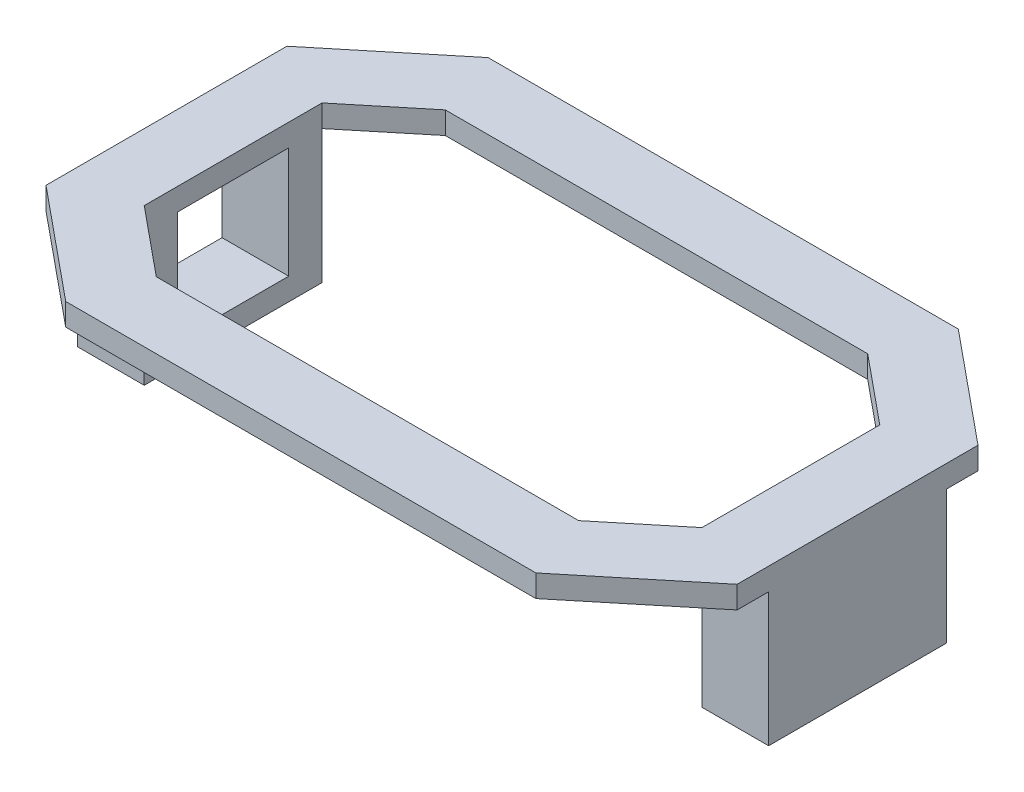
ISO-10303-21;
HEADER;
FILE_DESCRIPTION(('STEP AP214'),'2;1');
FILE_NAME('part.step','',(''),(''),'','','');
FILE_SCHEMA(('AUTOMOTIVE_DESIGN { 1 0 10303 214 1 1 1 1 }'));
ENDSEC;
DATA;
#1=APPLICATION_CONTEXT('core data for automotive mechanical design processes');
#2=APPLICATION_PROTOCOL_DEFINITION('international standard','automotive_design',2000,#1);
#3=PRODUCT_CONTEXT('',#1,'mechanical');
#4=PRODUCT('Part','Part','',(#3));
#5=PRODUCT_RELATED_PRODUCT_CATEGORY('part','',(#4));
#6=PRODUCT_DEFINITION_FORMATION('','',#4);
#7=PRODUCT_DEFINITION_CONTEXT('part definition',#1,'design');
#8=PRODUCT_DEFINITION('design','',#6,#7);
#9=PRODUCT_DEFINITION_SHAPE('','',#8);
#10=(LENGTH_UNIT() NAMED_UNIT(*) SI_UNIT(.MILLI.,.METRE.));
#11=(NAMED_UNIT(*) PLANE_ANGLE_UNIT() SI_UNIT($,.RADIAN.));
#12=(NAMED_UNIT(*) SI_UNIT($,.STERADIAN.) SOLID_ANGLE_UNIT());
#13=UNCERTAINTY_MEASURE_WITH_UNIT(LENGTH_MEASURE(1.E-05),#10,'distance_accuracy_value','');
#14=(GEOMETRIC_REPRESENTATION_CONTEXT(3) GLOBAL_UNCERTAINTY_ASSIGNED_CONTEXT((#13)) GLOBAL_UNIT_ASSIGNED_CONTEXT((#10,
#11,#12)) REPRESENTATION_CONTEXT('',''));
#15=CARTESIAN_POINT('',(0.,0.,0.));
#16=DIRECTION('',(0.,0.,1.));
#17=DIRECTION('',(1.,0.,0.));
#18=AXIS2_PLACEMENT_3D('',#15,#16,#17);
#19=CARTESIAN_POINT('',(0.,30.,0.));
#20=DIRECTION('',(0.,-1.,0.));
#21=DIRECTION('',(0.,0.,-1.));
#22=AXIS2_PLACEMENT_3D('',#19,#20,#21);
#23=PLANE('',#22);
#24=DIRECTION('',(0.,0.,-1.));
#25=VECTOR('',#24,1.);
#26=CARTESIAN_POINT('',(155.43,30.,-47.0896544328969));
#27=LINE('',#26,#25);
#28=CARTESIAN_POINT('',(155.43,30.,-40.));
#29=VERTEX_POINT('',#28);
#30=CARTESIAN_POINT('',(155.43,30.,-47.0896544328969));
#31=VERTEX_POINT('',#30);
#32=EDGE_CURVE('E363',#29,#31,#27,.T.);
#33=ORIENTED_EDGE('',*,*,#32,.F.);
#34=DIRECTION('',(-1.,0.,0.));
#35=VECTOR('',#34,1.);
#36=CARTESIAN_POINT('',(140.43,30.,-40.));
#37=LINE('',#36,#35);
#38=CARTESIAN_POINT('',(140.43,30.,-40.));
#39=VERTEX_POINT('',#38);
#40=EDGE_CURVE('E265',#29,#39,#37,.T.);
#41=ORIENTED_EDGE('',*,*,#40,.T.);
#42=DIRECTION('',(-0.772677324843957,0.,-0.634798985248076));
#43=VECTOR('',#42,1.);
#44=CARTESIAN_POINT('',(125.215,30.,-52.5));
#45=LINE('',#44,#43);
#46=CARTESIAN_POINT('',(125.215,30.,-52.5));
#47=VERTEX_POINT('',#46);
#48=EDGE_CURVE('E287',#39,#47,#45,.T.);
#49=ORIENTED_EDGE('',*,*,#48,.T.);
#50=DIRECTION('',(-1.,0.,0.));
#51=VECTOR('',#50,1.);
#52=CARTESIAN_POINT('',(30.215,30.,-52.5));
#53=LINE('',#52,#51);
#54=CARTESIAN_POINT('',(30.215,30.,-52.5));
#55=VERTEX_POINT('',#54);
#56=EDGE_CURVE('E309',#47,#55,#53,.T.);
#57=ORIENTED_EDGE('',*,*,#56,.T.);
#58=DIRECTION('',(-0.772677324843957,0.,0.634798985248075));
#59=VECTOR('',#58,1.);
#60=CARTESIAN_POINT('',(15.,30.,-40.));
#61=LINE('',#60,#59);
#62=CARTESIAN_POINT('',(15.,30.,-40.));
#63=VERTEX_POINT('',#62);
#64=EDGE_CURVE('E312',#55,#63,#61,.T.);
#65=ORIENTED_EDGE('',*,*,#64,.T.);
#66=DIRECTION('',(-1.,0.,0.));
#67=VECTOR('',#66,1.);
#68=CARTESIAN_POINT('',(0.,30.,-40.));
#69=LINE('',#68,#67);
#70=CARTESIAN_POINT('',(0.,30.,-40.));
#71=VERTEX_POINT('',#70);
#72=EDGE_CURVE('E431',#63,#71,#69,.T.);
#73=ORIENTED_EDGE('',*,*,#72,.T.);
#74=DIRECTION('',(0.,0.,1.));
#75=VECTOR('',#74,1.);
#76=CARTESIAN_POINT('',(0.,30.,7.08965443289685));
#77=LINE('',#76,#75);
#78=CARTESIAN_POINT('',(0.,30.,-47.0896544328969));
#79=VERTEX_POINT('',#78);
#80=EDGE_CURVE('E374',#79,#71,#77,.T.);
#81=ORIENTED_EDGE('',*,*,#80,.F.);
#82=DIRECTION('',(-0.772677324843957,0.,0.634798985248075));
#83=VECTOR('',#82,1.);
#84=CARTESIAN_POINT('',(0.,30.,-47.0896544328969));
#85=LINE('',#84,#83);
#86=CARTESIAN_POINT('',(24.8434726242779,30.,-67.5));
#87=VERTEX_POINT('',#86);
#88=EDGE_CURVE('E371',#87,#79,#85,.T.);
#89=ORIENTED_EDGE('',*,*,#88,.F.);
#90=DIRECTION('',(-1.,0.,0.));
#91=VECTOR('',#90,1.);
#92=CARTESIAN_POINT('',(24.8434726242779,30.,-67.5));
#93=LINE('',#92,#91);
#94=CARTESIAN_POINT('',(130.586527375722,30.,-67.5));
#95=VERTEX_POINT('',#94);
#96=EDGE_CURVE('E369',#95,#87,#93,.T.);
#97=ORIENTED_EDGE('',*,*,#96,.F.);
#98=DIRECTION('',(-0.772677324843956,0.,-0.634798985248076));
#99=VECTOR('',#98,1.);
#100=CARTESIAN_POINT('',(130.586527375722,30.,-67.5));
#101=LINE('',#100,#99);
#102=EDGE_CURVE('E367',#31,#95,#101,.T.);
#103=ORIENTED_EDGE('',*,*,#102,.F.);
#104=EDGE_LOOP('',(#33,#41,#49,#57,#65,#73,#81,#89,#97,#103));
#105=FACE_BOUND('',#104,.T.);
#106=ADVANCED_FACE('F39',(#105),#23,.T.);
#107=CARTESIAN_POINT('',(0.,0.,0.));
#108=DIRECTION('',(0.,-1.,0.));
#109=DIRECTION('',(0.,0.,-1.));
#110=AXIS2_PLACEMENT_3D('',#107,#108,#109);
#111=PLANE('',#110);
#112=CARTESIAN_POINT('',(11.25,0.,-5.));
#113=DIRECTION('',(0.,1.,0.));
#114=DIRECTION('',(0.,0.,-1.));
#115=AXIS2_PLACEMENT_3D('',#112,#113,#114);
#116=CIRCLE('',#115,2.);
#117=CARTESIAN_POINT('',(11.25,0.,-6.99999999999999));
#118=VERTEX_POINT('',#117);
#119=EDGE_CURVE('E410',#118,#118,#116,.T.);
#120=ORIENTED_EDGE('',*,*,#119,.T.);
#121=EDGE_LOOP('',(#120));
#122=FACE_BOUND('',#121,.T.);
#123=CARTESIAN_POINT('',(3.74999999999998,0.,-35.));
#124=DIRECTION('',(0.,1.,0.));
#125=DIRECTION('',(0.,0.,-1.));
#126=AXIS2_PLACEMENT_3D('',#123,#124,#125);
#127=CIRCLE('',#126,1.99999999999999);
#128=CARTESIAN_POINT('',(3.74999999999998,0.,-37.));
#129=VERTEX_POINT('',#128);
#130=EDGE_CURVE('E422',#129,#129,#127,.T.);
#131=ORIENTED_EDGE('',*,*,#130,.T.);
#132=EDGE_LOOP('',(#131));
#133=FACE_BOUND('',#132,.T.);
#134=DIRECTION('',(0.,0.,1.));
#135=VECTOR('',#134,1.);
#136=CARTESIAN_POINT('',(0.,0.,0.));
#137=LINE('',#136,#135);
#138=CARTESIAN_POINT('',(0.,0.,-40.));
#139=VERTEX_POINT('',#138);
#140=CARTESIAN_POINT('',(0.,0.,0.));
#141=VERTEX_POINT('',#140);
#142=EDGE_CURVE('E427',#139,#141,#137,.T.);
#143=ORIENTED_EDGE('',*,*,#142,.F.);
#144=DIRECTION('',(-1.,0.,0.));
#145=VECTOR('',#144,1.);
#146=CARTESIAN_POINT('',(0.,0.,-40.));
#147=LINE('',#146,#145);
#148=CARTESIAN_POINT('',(15.,0.,-40.));
#149=VERTEX_POINT('',#148);
#150=EDGE_CURVE('E432',#149,#139,#147,.T.);
#151=ORIENTED_EDGE('',*,*,#150,.F.);
#152=DIRECTION('',(0.,0.,-1.));
#153=VECTOR('',#152,1.);
#154=CARTESIAN_POINT('',(15.,0.,0.));
#155=LINE('',#154,#153);
#156=CARTESIAN_POINT('',(15.,0.,0.));
#157=VERTEX_POINT('',#156);
#158=EDGE_CURVE('E440',#157,#149,#155,.T.);
#159=ORIENTED_EDGE('',*,*,#158,.F.);
#160=DIRECTION('',(1.,0.,0.));
#161=VECTOR('',#160,1.);
#162=CARTESIAN_POINT('',(0.,0.,0.));
#163=LINE('',#162,#161);
#164=EDGE_CURVE('E438',#141,#157,#163,.T.);
#165=ORIENTED_EDGE('',*,*,#164,.F.);
#166=EDGE_LOOP('',(#143,#151,#159,#165));
#167=FACE_BOUND('',#166,.T.);
#168=CARTESIAN_POINT('',(11.25,0.,-35.));
#169=DIRECTION('',(0.,1.,0.));
#170=DIRECTION('',(0.,0.,1.));
#171=AXIS2_PLACEMENT_3D('',#168,#169,#170);
#172=CIRCLE('',#171,1.99999999999999);
#173=CARTESIAN_POINT('',(11.25,0.,-33.));
#174=VERTEX_POINT('',#173);
#175=EDGE_CURVE('E417',#174,#174,#172,.T.);
#176=ORIENTED_EDGE('',*,*,#175,.T.);
#177=EDGE_LOOP('',(#176));
#178=FACE_BOUND('',#177,.T.);
#179=CARTESIAN_POINT('',(3.74999999999998,0.,-5.));
#180=DIRECTION('',(0.,1.,0.));
#181=DIRECTION('',(0.,0.,1.));
#182=AXIS2_PLACEMENT_3D('',#179,#180,#181);
#183=CIRCLE('',#182,2.);
#184=CARTESIAN_POINT('',(3.74999999999998,0.,-3.));
#185=VERTEX_POINT('',#184);
#186=EDGE_CURVE('E407',#185,#185,#183,.T.);
#187=ORIENTED_EDGE('',*,*,#186,.T.);
#188=EDGE_LOOP('',(#187));
#189=FACE_BOUND('',#188,.T.);
#190=ADVANCED_FACE('F482',(#122,#133,#167,#178,#189),#111,.T.);
#191=CARTESIAN_POINT('',(0.,30.,0.));
#192=DIRECTION('',(1.,0.,0.));
#193=DIRECTION('',(0.,0.,-1.));
#194=AXIS2_PLACEMENT_3D('',#191,#192,#193);
#195=PLANE('',#194);
#196=DIRECTION('',(0.,0.,-1.));
#197=VECTOR('',#196,1.);
#198=CARTESIAN_POINT('',(0.,5.,0.));
#199=LINE('',#198,#197);
#200=CARTESIAN_POINT('',(0.,5.,-7.5));
#201=VERTEX_POINT('',#200);
#202=CARTESIAN_POINT('',(0.,5.,-32.5));
#203=VERTEX_POINT('',#202);
#204=EDGE_CURVE('E243',#201,#203,#199,.T.);
#205=ORIENTED_EDGE('',*,*,#204,.T.);
#206=DIRECTION('',(0.,1.,0.));
#207=VECTOR('',#206,1.);
#208=CARTESIAN_POINT('',(0.,30.,-32.5));
#209=LINE('',#208,#207);
#210=CARTESIAN_POINT('',(0.,30.,-32.5));
#211=VERTEX_POINT('',#210);
#212=EDGE_CURVE('E246',#203,#211,#209,.T.);
#213=ORIENTED_EDGE('',*,*,#212,.T.);
#214=DIRECTION('',(0.,0.,1.));
#215=VECTOR('',#214,1.);
#216=CARTESIAN_POINT('',(0.,30.,0.));
#217=LINE('',#216,#215);
#218=CARTESIAN_POINT('',(0.,30.,-7.5));
#219=VERTEX_POINT('',#218);
#220=EDGE_CURVE('E238',#211,#219,#217,.T.);
#221=ORIENTED_EDGE('',*,*,#220,.T.);
#222=DIRECTION('',(0.,-1.,0.));
#223=VECTOR('',#222,1.);
#224=CARTESIAN_POINT('',(0.,30.,-7.5));
#225=LINE('',#224,#223);
#226=EDGE_CURVE('E218',#219,#201,#225,.T.);
#227=ORIENTED_EDGE('',*,*,#226,.T.);
#228=EDGE_LOOP('',(#205,#213,#221,#227));
#229=FACE_BOUND('',#228,.T.);
#230=ORIENTED_EDGE('',*,*,#142,.T.);
#231=DIRECTION('',(0.,-1.,0.));
#232=VECTOR('',#231,1.);
#233=CARTESIAN_POINT('',(0.,30.,0.));
#234=LINE('',#233,#232);
#235=CARTESIAN_POINT('',(0.,30.,0.));
#236=VERTEX_POINT('',#235);
#237=EDGE_CURVE('E451',#236,#141,#234,.T.);
#238=ORIENTED_EDGE('',*,*,#237,.F.);
#239=CARTESIAN_POINT('',(0.,30.,7.08965443289685));
#240=VERTEX_POINT('',#239);
#241=EDGE_CURVE('E373',#236,#240,#77,.T.);
#242=ORIENTED_EDGE('',*,*,#241,.T.);
#243=DIRECTION('',(0.,-1.,0.));
#244=VECTOR('',#243,1.);
#245=CARTESIAN_POINT('',(0.,35.,7.08965443289685));
#246=LINE('',#245,#244);
#247=CARTESIAN_POINT('',(0.,35.,7.08965443289685));
#248=VERTEX_POINT('',#247);
#249=EDGE_CURVE('E385',#248,#240,#246,.T.);
#250=ORIENTED_EDGE('',*,*,#249,.F.);
#251=DIRECTION('',(0.,0.,1.));
#252=VECTOR('',#251,1.);
#253=CARTESIAN_POINT('',(0.,35.,7.08965443289685));
#254=LINE('',#253,#252);
#255=CARTESIAN_POINT('',(0.,35.,-47.0896544328969));
#256=VERTEX_POINT('',#255);
#257=EDGE_CURVE('E354',#256,#248,#254,.T.);
#258=ORIENTED_EDGE('',*,*,#257,.F.);
#259=DIRECTION('',(0.,-1.,0.));
#260=VECTOR('',#259,1.);
#261=CARTESIAN_POINT('',(0.,35.,-47.0896544328969));
#262=LINE('',#261,#260);
#263=EDGE_CURVE('E388',#256,#79,#262,.T.);
#264=ORIENTED_EDGE('',*,*,#263,.T.);
#265=ORIENTED_EDGE('',*,*,#80,.T.);
#266=DIRECTION('',(0.,-1.,0.));
#267=VECTOR('',#266,1.);
#268=CARTESIAN_POINT('',(0.,30.,-40.));
#269=LINE('',#268,#267);
#270=EDGE_CURVE('E435',#71,#139,#269,.T.);
#271=ORIENTED_EDGE('',*,*,#270,.T.);
#272=EDGE_LOOP('',(#230,#238,#242,#250,#258,#264,#265,#271));
#273=FACE_BOUND('',#272,.T.);
#274=ADVANCED_FACE('F41',(#229,#273),#195,.F.);
#275=CARTESIAN_POINT('',(0.,30.,0.));
#276=DIRECTION('',(0.,0.,-1.));
#277=DIRECTION('',(-1.,0.,0.));
#278=AXIS2_PLACEMENT_3D('',#275,#276,#277);
#279=PLANE('',#278);
#280=ORIENTED_EDGE('',*,*,#164,.T.);
#281=DIRECTION('',(0.,-1.,0.));
#282=VECTOR('',#281,1.);
#283=CARTESIAN_POINT('',(15.,30.,0.));
#284=LINE('',#283,#282);
#285=CARTESIAN_POINT('',(15.,30.,0.));
#286=VERTEX_POINT('',#285);
#287=EDGE_CURVE('E448',#286,#157,#284,.T.);
#288=ORIENTED_EDGE('',*,*,#287,.F.);
#289=DIRECTION('',(1.,0.,0.));
#290=VECTOR('',#289,1.);
#291=CARTESIAN_POINT('',(0.,30.,0.));
#292=LINE('',#291,#290);
#293=EDGE_CURVE('E428',#236,#286,#292,.T.);
#294=ORIENTED_EDGE('',*,*,#293,.F.);
#295=ORIENTED_EDGE('',*,*,#237,.T.);
#296=EDGE_LOOP('',(#280,#288,#294,#295));
#297=FACE_BOUND('',#296,.T.);
#298=ADVANCED_FACE('F541',(#297),#279,.F.);
#299=CARTESIAN_POINT('',(15.,30.,0.));
#300=DIRECTION('',(-1.,0.,0.));
#301=DIRECTION('',(0.,0.,1.));
#302=AXIS2_PLACEMENT_3D('',#299,#300,#301);
#303=PLANE('',#302);
#304=DIRECTION('',(0.,0.,1.));
#305=VECTOR('',#304,1.);
#306=CARTESIAN_POINT('',(15.,30.,-32.5));
#307=LINE('',#306,#305);
#308=CARTESIAN_POINT('',(15.,30.,-32.5));
#309=VERTEX_POINT('',#308);
#310=CARTESIAN_POINT('',(15.,30.,-7.5));
#311=VERTEX_POINT('',#310);
#312=EDGE_CURVE('E224',#309,#311,#307,.T.);
#313=ORIENTED_EDGE('',*,*,#312,.F.);
#314=DIRECTION('',(0.,1.,0.));
#315=VECTOR('',#314,1.);
#316=CARTESIAN_POINT('',(15.,30.,-32.5));
#317=LINE('',#316,#315);
#318=CARTESIAN_POINT('',(15.,5.,-32.5));
#319=VERTEX_POINT('',#318);
#320=EDGE_CURVE('E62',#319,#309,#317,.T.);
#321=ORIENTED_EDGE('',*,*,#320,.F.);
#322=DIRECTION('',(0.,0.,-1.));
#323=VECTOR('',#322,1.);
#324=CARTESIAN_POINT('',(15.,5.,-32.5));
#325=LINE('',#324,#323);
#326=CARTESIAN_POINT('',(15.,5.,-7.5));
#327=VERTEX_POINT('',#326);
#328=EDGE_CURVE('E231',#327,#319,#325,.T.);
#329=ORIENTED_EDGE('',*,*,#328,.F.);
#330=DIRECTION('',(0.,-1.,0.));
#331=VECTOR('',#330,1.);
#332=CARTESIAN_POINT('',(15.,30.,-7.5));
#333=LINE('',#332,#331);
#334=EDGE_CURVE('E215',#311,#327,#333,.T.);
#335=ORIENTED_EDGE('',*,*,#334,.F.);
#336=EDGE_LOOP('',(#313,#321,#329,#335));
#337=FACE_BOUND('',#336,.T.);
#338=ORIENTED_EDGE('',*,*,#158,.T.);
#339=DIRECTION('',(0.,-1.,0.));
#340=VECTOR('',#339,1.);
#341=CARTESIAN_POINT('',(15.,30.,-40.));
#342=LINE('',#341,#340);
#343=EDGE_CURVE('E445',#63,#149,#342,.T.);
#344=ORIENTED_EDGE('',*,*,#343,.F.);
#345=DIRECTION('',(0.,-1.,0.));
#346=VECTOR('',#345,1.);
#347=CARTESIAN_POINT('',(15.,35.,-40.));
#348=LINE('',#347,#346);
#349=CARTESIAN_POINT('',(15.,35.,-40.));
#350=VERTEX_POINT('',#349);
#351=EDGE_CURVE('E333',#350,#63,#348,.T.);
#352=ORIENTED_EDGE('',*,*,#351,.F.);
#353=DIRECTION('',(0.,0.,1.));
#354=VECTOR('',#353,1.);
#355=CARTESIAN_POINT('',(15.,35.,0.));
#356=LINE('',#355,#354);
#357=CARTESIAN_POINT('',(15.,35.,0.));
#358=VERTEX_POINT('',#357);
#359=EDGE_CURVE('E295',#350,#358,#356,.T.);
#360=ORIENTED_EDGE('',*,*,#359,.T.);
#361=DIRECTION('',(0.,-1.,0.));
#362=VECTOR('',#361,1.);
#363=CARTESIAN_POINT('',(15.,35.,0.));
#364=LINE('',#363,#362);
#365=EDGE_CURVE('E330',#358,#286,#364,.T.);
#366=ORIENTED_EDGE('',*,*,#365,.T.);
#367=ORIENTED_EDGE('',*,*,#287,.T.);
#368=EDGE_LOOP('',(#338,#344,#352,#360,#366,#367));
#369=FACE_BOUND('',#368,.T.);
#370=ADVANCED_FACE('F228',(#337,#369),#303,.F.);
#371=CARTESIAN_POINT('',(0.,30.,-40.));
#372=DIRECTION('',(0.,0.,1.));
#373=DIRECTION('',(1.,0.,0.));
#374=AXIS2_PLACEMENT_3D('',#371,#372,#373);
#375=PLANE('',#374);
#376=ORIENTED_EDGE('',*,*,#150,.T.);
#377=ORIENTED_EDGE('',*,*,#270,.F.);
#378=ORIENTED_EDGE('',*,*,#72,.F.);
#379=ORIENTED_EDGE('',*,*,#343,.T.);
#380=EDGE_LOOP('',(#376,#377,#378,#379));
#381=FACE_BOUND('',#380,.T.);
#382=ADVANCED_FACE('F535',(#381),#375,.F.);
#383=CARTESIAN_POINT('',(3.74999999999998,30.,-35.));
#384=DIRECTION('',(0.,-1.,0.));
#385=DIRECTION('',(0.,0.,-1.));
#386=AXIS2_PLACEMENT_3D('',#383,#384,#385);
#387=CYLINDRICAL_SURFACE('',#386,1.99999999999999);
#388=CARTESIAN_POINT('',(3.74999999999998,30.,-35.));
#389=DIRECTION('',(0.,1.,0.));
#390=DIRECTION('',(0.,0.,-1.));
#391=AXIS2_PLACEMENT_3D('',#388,#389,#390);
#392=CIRCLE('',#391,1.99999999999999);
#393=CARTESIAN_POINT('',(3.74999999999998,30.,-37.));
#394=VERTEX_POINT('',#393);
#395=EDGE_CURVE('E411',#394,#394,#392,.T.);
#396=ORIENTED_EDGE('',*,*,#395,.T.);
#397=EDGE_LOOP('',(#396));
#398=FACE_BOUND('',#397,.T.);
#399=ORIENTED_EDGE('',*,*,#130,.F.);
#400=EDGE_LOOP('',(#399));
#401=FACE_BOUND('',#400,.T.);
#402=ADVANCED_FACE('F532',(#398,#401),#387,.F.);
#403=CARTESIAN_POINT('',(11.25,30.,-35.));
#404=DIRECTION('',(0.,-1.,0.));
#405=DIRECTION('',(0.,0.,-1.));
#406=AXIS2_PLACEMENT_3D('',#403,#404,#405);
#407=CYLINDRICAL_SURFACE('',#406,1.99999999999999);
#408=CARTESIAN_POINT('',(11.25,30.,-35.));
#409=DIRECTION('',(0.,1.,0.));
#410=DIRECTION('',(0.,0.,1.));
#411=AXIS2_PLACEMENT_3D('',#408,#409,#410);
#412=CIRCLE('',#411,1.99999999999999);
#413=CARTESIAN_POINT('',(11.25,30.,-33.));
#414=VERTEX_POINT('',#413);
#415=EDGE_CURVE('E414',#414,#414,#412,.T.);
#416=ORIENTED_EDGE('',*,*,#415,.T.);
#417=EDGE_LOOP('',(#416));
#418=FACE_BOUND('',#417,.T.);
#419=ORIENTED_EDGE('',*,*,#175,.F.);
#420=EDGE_LOOP('',(#419));
#421=FACE_BOUND('',#420,.T.);
#422=ADVANCED_FACE('F525',(#418,#421),#407,.F.);
#423=CARTESIAN_POINT('',(11.25,30.,-5.));
#424=DIRECTION('',(0.,-1.,0.));
#425=DIRECTION('',(0.,0.,-1.));
#426=AXIS2_PLACEMENT_3D('',#423,#424,#425);
#427=CYLINDRICAL_SURFACE('',#426,2.);
#428=CARTESIAN_POINT('',(11.25,30.,-5.));
#429=DIRECTION('',(0.,1.,0.));
#430=DIRECTION('',(0.,0.,-1.));
#431=AXIS2_PLACEMENT_3D('',#428,#429,#430);
#432=CIRCLE('',#431,2.);
#433=CARTESIAN_POINT('',(11.25,30.,-6.99999999999999));
#434=VERTEX_POINT('',#433);
#435=EDGE_CURVE('E406',#434,#434,#432,.T.);
#436=ORIENTED_EDGE('',*,*,#435,.T.);
#437=EDGE_LOOP('',(#436));
#438=FACE_BOUND('',#437,.T.);
#439=ORIENTED_EDGE('',*,*,#119,.F.);
#440=EDGE_LOOP('',(#439));
#441=FACE_BOUND('',#440,.T.);
#442=ADVANCED_FACE('F515',(#438,#441),#427,.F.);
#443=CARTESIAN_POINT('',(3.74999999999998,30.,-5.));
#444=DIRECTION('',(0.,-1.,0.));
#445=DIRECTION('',(0.,0.,-1.));
#446=AXIS2_PLACEMENT_3D('',#443,#444,#445);
#447=CYLINDRICAL_SURFACE('',#446,2.);
#448=CARTESIAN_POINT('',(3.74999999999998,30.,-5.));
#449=DIRECTION('',(0.,1.,0.));
#450=DIRECTION('',(0.,0.,1.));
#451=AXIS2_PLACEMENT_3D('',#448,#449,#450);
#452=CIRCLE('',#451,2.);
#453=CARTESIAN_POINT('',(3.74999999999998,30.,-3.));
#454=VERTEX_POINT('',#453);
#455=EDGE_CURVE('E403',#454,#454,#452,.T.);
#456=ORIENTED_EDGE('',*,*,#455,.T.);
#457=EDGE_LOOP('',(#456));
#458=FACE_BOUND('',#457,.T.);
#459=ORIENTED_EDGE('',*,*,#186,.F.);
#460=EDGE_LOOP('',(#459));
#461=FACE_BOUND('',#460,.T.);
#462=ADVANCED_FACE('F507',(#458,#461),#447,.F.);
#463=ORIENTED_EDGE('',*,*,#455,.F.);
#464=EDGE_LOOP('',(#463));
#465=FACE_BOUND('',#464,.T.);
#466=ADVANCED_FACE('F495',(#465),#23,.T.);
#467=ORIENTED_EDGE('',*,*,#435,.F.);
#468=EDGE_LOOP('',(#467));
#469=FACE_BOUND('',#468,.T.);
#470=ADVANCED_FACE('F506',(#469),#23,.T.);
#471=ORIENTED_EDGE('',*,*,#415,.F.);
#472=EDGE_LOOP('',(#471));
#473=FACE_BOUND('',#472,.T.);
#474=ADVANCED_FACE('F513',(#473),#23,.T.);
#475=ORIENTED_EDGE('',*,*,#395,.F.);
#476=EDGE_LOOP('',(#475));
#477=FACE_BOUND('',#476,.T.);
#478=ADVANCED_FACE('F503',(#477),#23,.T.);
#479=CARTESIAN_POINT('',(0.,35.,0.));
#480=DIRECTION('',(0.,-1.,0.));
#481=DIRECTION('',(0.,0.,-1.));
#482=AXIS2_PLACEMENT_3D('',#479,#480,#481);
#483=PLANE('',#482);
#484=DIRECTION('',(0.772677324843957,0.,-0.634798985248076));
#485=VECTOR('',#484,1.);
#486=CARTESIAN_POINT('',(155.43,35.,7.08965443289687));
#487=LINE('',#486,#485);
#488=CARTESIAN_POINT('',(130.586527375722,35.,27.5));
#489=VERTEX_POINT('',#488);
#490=CARTESIAN_POINT('',(155.43,35.,7.08965443289687));
#491=VERTEX_POINT('',#490);
#492=EDGE_CURVE('E342',#489,#491,#487,.T.);
#493=ORIENTED_EDGE('',*,*,#492,.T.);
#494=DIRECTION('',(0.,0.,-1.));
#495=VECTOR('',#494,1.);
#496=CARTESIAN_POINT('',(155.43,35.,-47.0896544328969));
#497=LINE('',#496,#495);
#498=CARTESIAN_POINT('',(155.43,35.,-47.0896544328969));
#499=VERTEX_POINT('',#498);
#500=EDGE_CURVE('E345',#491,#499,#497,.T.);
#501=ORIENTED_EDGE('',*,*,#500,.T.);
#502=DIRECTION('',(-0.772677324843956,0.,-0.634798985248076));
#503=VECTOR('',#502,1.);
#504=CARTESIAN_POINT('',(130.586527375722,35.,-67.5));
#505=LINE('',#504,#503);
#506=CARTESIAN_POINT('',(130.586527375722,35.,-67.5));
#507=VERTEX_POINT('',#506);
#508=EDGE_CURVE('E348',#499,#507,#505,.T.);
#509=ORIENTED_EDGE('',*,*,#508,.T.);
#510=DIRECTION('',(-1.,0.,0.));
#511=VECTOR('',#510,1.);
#512=CARTESIAN_POINT('',(24.8434726242779,35.,-67.5));
#513=LINE('',#512,#511);
#514=CARTESIAN_POINT('',(24.8434726242779,35.,-67.5));
#515=VERTEX_POINT('',#514);
#516=EDGE_CURVE('E350',#507,#515,#513,.T.);
#517=ORIENTED_EDGE('',*,*,#516,.T.);
#518=DIRECTION('',(-0.772677324843957,0.,0.634798985248075));
#519=VECTOR('',#518,1.);
#520=CARTESIAN_POINT('',(0.,35.,-47.0896544328969));
#521=LINE('',#520,#519);
#522=EDGE_CURVE('E352',#515,#256,#521,.T.);
#523=ORIENTED_EDGE('',*,*,#522,.T.);
#524=ORIENTED_EDGE('',*,*,#257,.T.);
#525=DIRECTION('',(0.772677324843957,0.,0.634798985248076));
#526=VECTOR('',#525,1.);
#527=CARTESIAN_POINT('',(24.8434726242779,35.,27.5));
#528=LINE('',#527,#526);
#529=CARTESIAN_POINT('',(24.8434726242779,35.,27.5));
#530=VERTEX_POINT('',#529);
#531=EDGE_CURVE('E356',#248,#530,#528,.T.);
#532=ORIENTED_EDGE('',*,*,#531,.T.);
#533=DIRECTION('',(1.,0.,0.));
#534=VECTOR('',#533,1.);
#535=CARTESIAN_POINT('',(130.586527375722,35.,27.5));
#536=LINE('',#535,#534);
#537=EDGE_CURVE('E358',#530,#489,#536,.T.);
#538=ORIENTED_EDGE('',*,*,#537,.T.);
#539=EDGE_LOOP('',(#493,#501,#509,#517,#523,#524,#532,#538));
#540=FACE_BOUND('',#539,.T.);
#541=DIRECTION('',(-0.772677324843957,0.,-0.634798985248076));
#542=VECTOR('',#541,1.);
#543=CARTESIAN_POINT('',(125.215,35.,-52.5));
#544=LINE('',#543,#542);
#545=CARTESIAN_POINT('',(140.43,35.,-40.));
#546=VERTEX_POINT('',#545);
#547=CARTESIAN_POINT('',(125.215,35.,-52.5));
#548=VERTEX_POINT('',#547);
#549=EDGE_CURVE('E288',#546,#548,#544,.T.);
#550=ORIENTED_EDGE('',*,*,#549,.F.);
#551=DIRECTION('',(0.,0.,-1.));
#552=VECTOR('',#551,1.);
#553=CARTESIAN_POINT('',(140.43,35.,-40.));
#554=LINE('',#553,#552);
#555=CARTESIAN_POINT('',(140.43,35.,0.));
#556=VERTEX_POINT('',#555);
#557=EDGE_CURVE('E304',#556,#546,#554,.T.);
#558=ORIENTED_EDGE('',*,*,#557,.F.);
#559=DIRECTION('',(0.772677324843957,0.,-0.634798985248076));
#560=VECTOR('',#559,1.);
#561=CARTESIAN_POINT('',(140.43,35.,0.));
#562=LINE('',#561,#560);
#563=CARTESIAN_POINT('',(125.215,35.,12.5));
#564=VERTEX_POINT('',#563);
#565=EDGE_CURVE('E301',#564,#556,#562,.T.);
#566=ORIENTED_EDGE('',*,*,#565,.F.);
#567=DIRECTION('',(1.,0.,0.));
#568=VECTOR('',#567,1.);
#569=CARTESIAN_POINT('',(125.215,35.,12.5));
#570=LINE('',#569,#568);
#571=CARTESIAN_POINT('',(30.215,35.,12.5));
#572=VERTEX_POINT('',#571);
#573=EDGE_CURVE('E299',#572,#564,#570,.T.);
#574=ORIENTED_EDGE('',*,*,#573,.F.);
#575=DIRECTION('',(0.772677324843957,0.,0.634798985248076));
#576=VECTOR('',#575,1.);
#577=CARTESIAN_POINT('',(30.215,35.,12.5));
#578=LINE('',#577,#576);
#579=EDGE_CURVE('E297',#358,#572,#578,.T.);
#580=ORIENTED_EDGE('',*,*,#579,.F.);
#581=ORIENTED_EDGE('',*,*,#359,.F.);
#582=DIRECTION('',(-0.772677324843957,0.,0.634798985248075));
#583=VECTOR('',#582,1.);
#584=CARTESIAN_POINT('',(15.,35.,-40.));
#585=LINE('',#584,#583);
#586=CARTESIAN_POINT('',(30.215,35.,-52.5));
#587=VERTEX_POINT('',#586);
#588=EDGE_CURVE('E293',#587,#350,#585,.T.);
#589=ORIENTED_EDGE('',*,*,#588,.F.);
#590=DIRECTION('',(-1.,0.,0.));
#591=VECTOR('',#590,1.);
#592=CARTESIAN_POINT('',(30.215,35.,-52.5));
#593=LINE('',#592,#591);
#594=EDGE_CURVE('E290',#548,#587,#593,.T.);
#595=ORIENTED_EDGE('',*,*,#594,.F.);
#596=EDGE_LOOP('',(#550,#558,#566,#574,#580,#581,#589,#595));
#597=FACE_BOUND('',#596,.T.);
#598=ADVANCED_FACE('F493',(#540,#597),#483,.F.);
#599=DIRECTION('',(0.772677324843957,0.,-0.634798985248076));
#600=VECTOR('',#599,1.);
#601=CARTESIAN_POINT('',(140.43,30.,0.));
#602=LINE('',#601,#600);
#603=CARTESIAN_POINT('',(125.215,30.,12.5));
#604=VERTEX_POINT('',#603);
#605=CARTESIAN_POINT('',(140.43,30.,0.));
#606=VERTEX_POINT('',#605);
#607=EDGE_CURVE('E291',#604,#606,#602,.T.);
#608=ORIENTED_EDGE('',*,*,#607,.T.);
#609=DIRECTION('',(1.,0.,0.));
#610=VECTOR('',#609,1.);
#611=CARTESIAN_POINT('',(140.43,30.,0.));
#612=LINE('',#611,#610);
#613=CARTESIAN_POINT('',(155.43,30.,0.));
#614=VERTEX_POINT('',#613);
#615=EDGE_CURVE('E261',#606,#614,#612,.T.);
#616=ORIENTED_EDGE('',*,*,#615,.T.);
#617=CARTESIAN_POINT('',(155.43,30.,7.08965443289687));
#618=VERTEX_POINT('',#617);
#619=EDGE_CURVE('E364',#618,#614,#27,.T.);
#620=ORIENTED_EDGE('',*,*,#619,.F.);
#621=DIRECTION('',(0.772677324843957,0.,-0.634798985248076));
#622=VECTOR('',#621,1.);
#623=CARTESIAN_POINT('',(155.43,30.,7.08965443289687));
#624=LINE('',#623,#622);
#625=CARTESIAN_POINT('',(130.586527375722,30.,27.5));
#626=VERTEX_POINT('',#625);
#627=EDGE_CURVE('E341',#626,#618,#624,.T.);
#628=ORIENTED_EDGE('',*,*,#627,.F.);
#629=DIRECTION('',(1.,0.,0.));
#630=VECTOR('',#629,1.);
#631=CARTESIAN_POINT('',(130.586527375722,30.,27.5));
#632=LINE('',#631,#630);
#633=CARTESIAN_POINT('',(24.8434726242779,30.,27.5));
#634=VERTEX_POINT('',#633);
#635=EDGE_CURVE('E346',#634,#626,#632,.T.);
#636=ORIENTED_EDGE('',*,*,#635,.F.);
#637=DIRECTION('',(0.772677324843957,0.,0.634798985248076));
#638=VECTOR('',#637,1.);
#639=CARTESIAN_POINT('',(24.8434726242779,30.,27.5));
#640=LINE('',#639,#638);
#641=EDGE_CURVE('E377',#240,#634,#640,.T.);
#642=ORIENTED_EDGE('',*,*,#641,.F.);
#643=ORIENTED_EDGE('',*,*,#241,.F.);
#644=ORIENTED_EDGE('',*,*,#293,.T.);
#645=DIRECTION('',(0.772677324843957,0.,0.634798985248076));
#646=VECTOR('',#645,1.);
#647=CARTESIAN_POINT('',(30.215,30.,12.5));
#648=LINE('',#647,#646);
#649=CARTESIAN_POINT('',(30.215,30.,12.5));
#650=VERTEX_POINT('',#649);
#651=EDGE_CURVE('E315',#286,#650,#648,.T.);
#652=ORIENTED_EDGE('',*,*,#651,.T.);
#653=DIRECTION('',(1.,0.,0.));
#654=VECTOR('',#653,1.);
#655=CARTESIAN_POINT('',(125.215,30.,12.5));
#656=LINE('',#655,#654);
#657=EDGE_CURVE('E318',#650,#604,#656,.T.);
#658=ORIENTED_EDGE('',*,*,#657,.T.);
#659=EDGE_LOOP('',(#608,#616,#620,#628,#636,#642,#643,#644,#652,#658));
#660=FACE_BOUND('',#659,.T.);
#661=ADVANCED_FACE('F478',(#660),#23,.T.);
#662=CARTESIAN_POINT('',(155.43,35.,7.08965443289687));
#663=DIRECTION('',(-0.634798985248076,0.,-0.772677324843957));
#664=DIRECTION('',(-0.772677324843957,0.,0.634798985248076));
#665=AXIS2_PLACEMENT_3D('',#662,#663,#664);
#666=PLANE('',#665);
#667=ORIENTED_EDGE('',*,*,#627,.T.);
#668=DIRECTION('',(0.,-1.,0.));
#669=VECTOR('',#668,1.);
#670=CARTESIAN_POINT('',(155.43,35.,7.08965443289687));
#671=LINE('',#670,#669);
#672=EDGE_CURVE('E400',#491,#618,#671,.T.);
#673=ORIENTED_EDGE('',*,*,#672,.F.);
#674=ORIENTED_EDGE('',*,*,#492,.F.);
#675=DIRECTION('',(0.,-1.,0.));
#676=VECTOR('',#675,1.);
#677=CARTESIAN_POINT('',(130.586527375722,35.,27.5));
#678=LINE('',#677,#676);
#679=EDGE_CURVE('E360',#489,#626,#678,.T.);
#680=ORIENTED_EDGE('',*,*,#679,.T.);
#681=EDGE_LOOP('',(#667,#673,#674,#680));
#682=FACE_BOUND('',#681,.T.);
#683=ADVANCED_FACE('F492',(#682),#666,.F.);
#684=CARTESIAN_POINT('',(155.43,35.,-47.0896544328969));
#685=DIRECTION('',(-1.,0.,0.));
#686=DIRECTION('',(0.,0.,1.));
#687=AXIS2_PLACEMENT_3D('',#684,#685,#686);
#688=PLANE('',#687);
#689=ORIENTED_EDGE('',*,*,#619,.T.);
#690=DIRECTION('',(0.,-1.,0.));
#691=VECTOR('',#690,1.);
#692=CARTESIAN_POINT('',(155.43,30.,0.));
#693=LINE('',#692,#691);
#694=CARTESIAN_POINT('',(155.43,0.,0.));
#695=VERTEX_POINT('',#694);
#696=EDGE_CURVE('E258',#614,#695,#693,.T.);
#697=ORIENTED_EDGE('',*,*,#696,.T.);
#698=DIRECTION('',(0.,0.,-1.));
#699=VECTOR('',#698,1.);
#700=CARTESIAN_POINT('',(155.43,0.,0.));
#701=LINE('',#700,#699);
#702=CARTESIAN_POINT('',(155.43,0.,-40.));
#703=VERTEX_POINT('',#702);
#704=EDGE_CURVE('E269',#695,#703,#701,.T.);
#705=ORIENTED_EDGE('',*,*,#704,.T.);
#706=DIRECTION('',(0.,-1.,0.));
#707=VECTOR('',#706,1.);
#708=CARTESIAN_POINT('',(155.43,30.,-40.));
#709=LINE('',#708,#707);
#710=EDGE_CURVE('E249',#29,#703,#709,.T.);
#711=ORIENTED_EDGE('',*,*,#710,.F.);
#712=ORIENTED_EDGE('',*,*,#32,.T.);
#713=DIRECTION('',(0.,-1.,0.));
#714=VECTOR('',#713,1.);
#715=CARTESIAN_POINT('',(155.43,35.,-47.0896544328969));
#716=LINE('',#715,#714);
#717=EDGE_CURVE('E397',#499,#31,#716,.T.);
#718=ORIENTED_EDGE('',*,*,#717,.F.);
#719=ORIENTED_EDGE('',*,*,#500,.F.);
#720=ORIENTED_EDGE('',*,*,#672,.T.);
#721=EDGE_LOOP('',(#689,#697,#705,#711,#712,#718,#719,#720));
#722=FACE_BOUND('',#721,.T.);
#723=ADVANCED_FACE('F500',(#722),#688,.F.);
#724=CARTESIAN_POINT('',(130.586527375722,35.,-67.5));
#725=DIRECTION('',(-0.634798985248076,0.,0.772677324843956));
#726=DIRECTION('',(0.772677324843956,0.,0.634798985248076));
#727=AXIS2_PLACEMENT_3D('',#724,#725,#726);
#728=PLANE('',#727);
#729=ORIENTED_EDGE('',*,*,#102,.T.);
#730=DIRECTION('',(0.,-1.,0.));
#731=VECTOR('',#730,1.);
#732=CARTESIAN_POINT('',(130.586527375722,35.,-67.5));
#733=LINE('',#732,#731);
#734=EDGE_CURVE('E394',#507,#95,#733,.T.);
#735=ORIENTED_EDGE('',*,*,#734,.F.);
#736=ORIENTED_EDGE('',*,*,#508,.F.);
#737=ORIENTED_EDGE('',*,*,#717,.T.);
#738=EDGE_LOOP('',(#729,#735,#736,#737));
#739=FACE_BOUND('',#738,.T.);
#740=ADVANCED_FACE('F610',(#739),#728,.F.);
#741=CARTESIAN_POINT('',(24.8434726242779,35.,-67.5));
#742=DIRECTION('',(0.,0.,1.));
#743=DIRECTION('',(1.,0.,0.));
#744=AXIS2_PLACEMENT_3D('',#741,#742,#743);
#745=PLANE('',#744);
#746=ORIENTED_EDGE('',*,*,#96,.T.);
#747=DIRECTION('',(0.,-1.,0.));
#748=VECTOR('',#747,1.);
#749=CARTESIAN_POINT('',(24.8434726242779,35.,-67.5));
#750=LINE('',#749,#748);
#751=EDGE_CURVE('E391',#515,#87,#750,.T.);
#752=ORIENTED_EDGE('',*,*,#751,.F.);
#753=ORIENTED_EDGE('',*,*,#516,.F.);
#754=ORIENTED_EDGE('',*,*,#734,.T.);
#755=EDGE_LOOP('',(#746,#752,#753,#754));
#756=FACE_BOUND('',#755,.T.);
#757=ADVANCED_FACE('F605',(#756),#745,.F.);
#758=CARTESIAN_POINT('',(0.,35.,-47.0896544328969));
#759=DIRECTION('',(0.634798985248075,0.,0.772677324843957));
#760=DIRECTION('',(0.772677324843958,0.,-0.634798985248075));
#761=AXIS2_PLACEMENT_3D('',#758,#759,#760);
#762=PLANE('',#761);
#763=ORIENTED_EDGE('',*,*,#88,.T.);
#764=ORIENTED_EDGE('',*,*,#263,.F.);
#765=ORIENTED_EDGE('',*,*,#522,.F.);
#766=ORIENTED_EDGE('',*,*,#751,.T.);
#767=EDGE_LOOP('',(#763,#764,#765,#766));
#768=FACE_BOUND('',#767,.T.);
#769=ADVANCED_FACE('F603',(#768),#762,.F.);
#770=CARTESIAN_POINT('',(24.8434726242779,35.,27.5));
#771=DIRECTION('',(0.634798985248076,0.,-0.772677324843957));
#772=DIRECTION('',(-0.772677324843957,0.,-0.634798985248076));
#773=AXIS2_PLACEMENT_3D('',#770,#771,#772);
#774=PLANE('',#773);
#775=ORIENTED_EDGE('',*,*,#641,.T.);
#776=DIRECTION('',(0.,-1.,0.));
#777=VECTOR('',#776,1.);
#778=CARTESIAN_POINT('',(24.8434726242779,35.,27.5));
#779=LINE('',#778,#777);
#780=EDGE_CURVE('E382',#530,#634,#779,.T.);
#781=ORIENTED_EDGE('',*,*,#780,.F.);
#782=ORIENTED_EDGE('',*,*,#531,.F.);
#783=ORIENTED_EDGE('',*,*,#249,.T.);
#784=EDGE_LOOP('',(#775,#781,#782,#783));
#785=FACE_BOUND('',#784,.T.);
#786=ADVANCED_FACE('F588',(#785),#774,.F.);
#787=CARTESIAN_POINT('',(130.586527375722,35.,27.5));
#788=DIRECTION('',(0.,0.,-1.));
#789=DIRECTION('',(-1.,0.,0.));
#790=AXIS2_PLACEMENT_3D('',#787,#788,#789);
#791=PLANE('',#790);
#792=ORIENTED_EDGE('',*,*,#635,.T.);
#793=ORIENTED_EDGE('',*,*,#679,.F.);
#794=ORIENTED_EDGE('',*,*,#537,.F.);
#795=ORIENTED_EDGE('',*,*,#780,.T.);
#796=EDGE_LOOP('',(#792,#793,#794,#795));
#797=FACE_BOUND('',#796,.T.);
#798=ADVANCED_FACE('F594',(#797),#791,.F.);
#799=CARTESIAN_POINT('',(125.215,35.,-52.5));
#800=DIRECTION('',(-0.634798985248076,0.,0.772677324843957));
#801=DIRECTION('',(0.772677324843957,0.,0.634798985248076));
#802=AXIS2_PLACEMENT_3D('',#799,#800,#801);
#803=PLANE('',#802);
#804=ORIENTED_EDGE('',*,*,#48,.F.);
#805=DIRECTION('',(0.,-1.,0.));
#806=VECTOR('',#805,1.);
#807=CARTESIAN_POINT('',(140.43,35.,-40.));
#808=LINE('',#807,#806);
#809=EDGE_CURVE('E306',#546,#39,#808,.T.);
#810=ORIENTED_EDGE('',*,*,#809,.F.);
#811=ORIENTED_EDGE('',*,*,#549,.T.);
#812=DIRECTION('',(0.,-1.,0.));
#813=VECTOR('',#812,1.);
#814=CARTESIAN_POINT('',(125.215,35.,-52.5));
#815=LINE('',#814,#813);
#816=EDGE_CURVE('E338',#548,#47,#815,.T.);
#817=ORIENTED_EDGE('',*,*,#816,.T.);
#818=EDGE_LOOP('',(#804,#810,#811,#817));
#819=FACE_BOUND('',#818,.T.);
#820=ADVANCED_FACE('F621',(#819),#803,.T.);
#821=CARTESIAN_POINT('',(30.215,35.,-52.5));
#822=DIRECTION('',(0.,0.,1.));
#823=DIRECTION('',(1.,0.,0.));
#824=AXIS2_PLACEMENT_3D('',#821,#822,#823);
#825=PLANE('',#824);
#826=ORIENTED_EDGE('',*,*,#56,.F.);
#827=ORIENTED_EDGE('',*,*,#816,.F.);
#828=ORIENTED_EDGE('',*,*,#594,.T.);
#829=DIRECTION('',(0.,-1.,0.));
#830=VECTOR('',#829,1.);
#831=CARTESIAN_POINT('',(30.215,35.,-52.5));
#832=LINE('',#831,#830);
#833=EDGE_CURVE('E336',#587,#55,#832,.T.);
#834=ORIENTED_EDGE('',*,*,#833,.T.);
#835=EDGE_LOOP('',(#826,#827,#828,#834));
#836=FACE_BOUND('',#835,.T.);
#837=ADVANCED_FACE('F624',(#836),#825,.T.);
#838=CARTESIAN_POINT('',(15.,35.,-40.));
#839=DIRECTION('',(0.634798985248075,0.,0.772677324843957));
#840=DIRECTION('',(0.772677324843958,0.,-0.634798985248075));
#841=AXIS2_PLACEMENT_3D('',#838,#839,#840);
#842=PLANE('',#841);
#843=ORIENTED_EDGE('',*,*,#64,.F.);
#844=ORIENTED_EDGE('',*,*,#833,.F.);
#845=ORIENTED_EDGE('',*,*,#588,.T.);
#846=ORIENTED_EDGE('',*,*,#351,.T.);
#847=EDGE_LOOP('',(#843,#844,#845,#846));
#848=FACE_BOUND('',#847,.T.);
#849=ADVANCED_FACE('F565',(#848),#842,.T.);
#850=CARTESIAN_POINT('',(30.215,35.,12.5));
#851=DIRECTION('',(0.634798985248076,0.,-0.772677324843957));
#852=DIRECTION('',(-0.772677324843957,0.,-0.634798985248076));
#853=AXIS2_PLACEMENT_3D('',#850,#851,#852);
#854=PLANE('',#853);
#855=ORIENTED_EDGE('',*,*,#651,.F.);
#856=ORIENTED_EDGE('',*,*,#365,.F.);
#857=ORIENTED_EDGE('',*,*,#579,.T.);
#858=DIRECTION('',(0.,-1.,0.));
#859=VECTOR('',#858,1.);
#860=CARTESIAN_POINT('',(30.215,35.,12.5));
#861=LINE('',#860,#859);
#862=EDGE_CURVE('E328',#572,#650,#861,.T.);
#863=ORIENTED_EDGE('',*,*,#862,.T.);
#864=EDGE_LOOP('',(#855,#856,#857,#863));
#865=FACE_BOUND('',#864,.T.);
#866=ADVANCED_FACE('F577',(#865),#854,.T.);
#867=CARTESIAN_POINT('',(125.215,35.,12.5));
#868=DIRECTION('',(0.,0.,-1.));
#869=DIRECTION('',(-1.,0.,0.));
#870=AXIS2_PLACEMENT_3D('',#867,#868,#869);
#871=PLANE('',#870);
#872=ORIENTED_EDGE('',*,*,#657,.F.);
#873=ORIENTED_EDGE('',*,*,#862,.F.);
#874=ORIENTED_EDGE('',*,*,#573,.T.);
#875=DIRECTION('',(0.,-1.,0.));
#876=VECTOR('',#875,1.);
#877=CARTESIAN_POINT('',(125.215,35.,12.5));
#878=LINE('',#877,#876);
#879=EDGE_CURVE('E326',#564,#604,#878,.T.);
#880=ORIENTED_EDGE('',*,*,#879,.T.);
#881=EDGE_LOOP('',(#872,#873,#874,#880));
#882=FACE_BOUND('',#881,.T.);
#883=ADVANCED_FACE('F580',(#882),#871,.T.);
#884=CARTESIAN_POINT('',(140.43,35.,0.));
#885=DIRECTION('',(-0.634798985248076,0.,-0.772677324843957));
#886=DIRECTION('',(-0.772677324843957,0.,0.634798985248076));
#887=AXIS2_PLACEMENT_3D('',#884,#885,#886);
#888=PLANE('',#887);
#889=ORIENTED_EDGE('',*,*,#607,.F.);
#890=ORIENTED_EDGE('',*,*,#879,.F.);
#891=ORIENTED_EDGE('',*,*,#565,.T.);
#892=DIRECTION('',(0.,-1.,0.));
#893=VECTOR('',#892,1.);
#894=CARTESIAN_POINT('',(140.43,35.,0.));
#895=LINE('',#894,#893);
#896=EDGE_CURVE('E324',#556,#606,#895,.T.);
#897=ORIENTED_EDGE('',*,*,#896,.T.);
#898=EDGE_LOOP('',(#889,#890,#891,#897));
#899=FACE_BOUND('',#898,.T.);
#900=ADVANCED_FACE('F631',(#899),#888,.T.);
#901=CARTESIAN_POINT('',(140.43,35.,-40.));
#902=DIRECTION('',(-1.,0.,0.));
#903=DIRECTION('',(0.,0.,1.));
#904=AXIS2_PLACEMENT_3D('',#901,#902,#903);
#905=PLANE('',#904);
#906=ORIENTED_EDGE('',*,*,#809,.T.);
#907=DIRECTION('',(0.,-1.,0.));
#908=VECTOR('',#907,1.);
#909=CARTESIAN_POINT('',(140.43,30.,-40.));
#910=LINE('',#909,#908);
#911=CARTESIAN_POINT('',(140.43,0.,-40.));
#912=VERTEX_POINT('',#911);
#913=EDGE_CURVE('E252',#39,#912,#910,.T.);
#914=ORIENTED_EDGE('',*,*,#913,.T.);
#915=DIRECTION('',(0.,0.,1.));
#916=VECTOR('',#915,1.);
#917=CARTESIAN_POINT('',(140.43,0.,0.));
#918=LINE('',#917,#916);
#919=CARTESIAN_POINT('',(140.43,0.,0.));
#920=VERTEX_POINT('',#919);
#921=EDGE_CURVE('E264',#912,#920,#918,.T.);
#922=ORIENTED_EDGE('',*,*,#921,.T.);
#923=DIRECTION('',(0.,-1.,0.));
#924=VECTOR('',#923,1.);
#925=CARTESIAN_POINT('',(140.43,30.,0.));
#926=LINE('',#925,#924);
#927=EDGE_CURVE('E255',#606,#920,#926,.T.);
#928=ORIENTED_EDGE('',*,*,#927,.F.);
#929=ORIENTED_EDGE('',*,*,#896,.F.);
#930=ORIENTED_EDGE('',*,*,#557,.T.);
#931=EDGE_LOOP('',(#906,#914,#922,#928,#929,#930));
#932=FACE_BOUND('',#931,.T.);
#933=ADVANCED_FACE('F627',(#932),#905,.T.);
#934=CARTESIAN_POINT('',(0.,0.,0.));
#935=DIRECTION('',(0.,-1.,0.));
#936=DIRECTION('',(0.,0.,-1.));
#937=AXIS2_PLACEMENT_3D('',#934,#935,#936);
#938=PLANE('',#937);
#939=CARTESIAN_POINT('',(151.68,0.,-35.));
#940=DIRECTION('',(0.,1.,0.));
#941=DIRECTION('',(0.,0.,1.));
#942=AXIS2_PLACEMENT_3D('',#939,#940,#941);
#943=CIRCLE('',#942,1.99999999999999);
#944=CARTESIAN_POINT('',(151.68,0.,-33.));
#945=VERTEX_POINT('',#944);
#946=EDGE_CURVE('E281',#945,#945,#943,.T.);
#947=ORIENTED_EDGE('',*,*,#946,.T.);
#948=EDGE_LOOP('',(#947));
#949=FACE_BOUND('',#948,.T.);
#950=CARTESIAN_POINT('',(144.18,0.,-5.));
#951=DIRECTION('',(0.,1.,0.));
#952=DIRECTION('',(0.,0.,1.));
#953=AXIS2_PLACEMENT_3D('',#950,#951,#952);
#954=CIRCLE('',#953,2.);
#955=CARTESIAN_POINT('',(144.18,0.,-3.));
#956=VERTEX_POINT('',#955);
#957=EDGE_CURVE('E272',#956,#956,#954,.T.);
#958=ORIENTED_EDGE('',*,*,#957,.T.);
#959=EDGE_LOOP('',(#958));
#960=FACE_BOUND('',#959,.T.);
#961=ORIENTED_EDGE('',*,*,#704,.F.);
#962=DIRECTION('',(1.,0.,0.));
#963=VECTOR('',#962,1.);
#964=CARTESIAN_POINT('',(140.43,0.,0.));
#965=LINE('',#964,#963);
#966=EDGE_CURVE('E262',#920,#695,#965,.T.);
#967=ORIENTED_EDGE('',*,*,#966,.F.);
#968=ORIENTED_EDGE('',*,*,#921,.F.);
#969=DIRECTION('',(-1.,0.,0.));
#970=VECTOR('',#969,1.);
#971=CARTESIAN_POINT('',(140.43,0.,-40.));
#972=LINE('',#971,#970);
#973=EDGE_CURVE('E267',#703,#912,#972,.T.);
#974=ORIENTED_EDGE('',*,*,#973,.F.);
#975=EDGE_LOOP('',(#961,#967,#968,#974));
#976=FACE_BOUND('',#975,.T.);
#977=CARTESIAN_POINT('',(151.68,0.,-5.));
#978=DIRECTION('',(0.,1.,0.));
#979=DIRECTION('',(0.,0.,-1.));
#980=AXIS2_PLACEMENT_3D('',#977,#978,#979);
#981=CIRCLE('',#980,2.);
#982=CARTESIAN_POINT('',(151.68,0.,-7.));
#983=VERTEX_POINT('',#982);
#984=EDGE_CURVE('E278',#983,#983,#981,.T.);
#985=ORIENTED_EDGE('',*,*,#984,.T.);
#986=EDGE_LOOP('',(#985));
#987=FACE_BOUND('',#986,.T.);
#988=CARTESIAN_POINT('',(144.18,0.,-35.));
#989=DIRECTION('',(0.,1.,0.));
#990=DIRECTION('',(0.,0.,-1.));
#991=AXIS2_PLACEMENT_3D('',#988,#989,#990);
#992=CIRCLE('',#991,1.99999999999999);
#993=CARTESIAN_POINT('',(144.18,0.,-37.));
#994=VERTEX_POINT('',#993);
#995=EDGE_CURVE('E284',#994,#994,#992,.T.);
#996=ORIENTED_EDGE('',*,*,#995,.T.);
#997=EDGE_LOOP('',(#996));
#998=FACE_BOUND('',#997,.T.);
#999=ADVANCED_FACE('F638',(#949,#960,#976,#987,#998),#938,.T.);
#1000=CARTESIAN_POINT('',(140.43,30.,-40.));
#1001=DIRECTION('',(0.,0.,1.));
#1002=DIRECTION('',(1.,0.,0.));
#1003=AXIS2_PLACEMENT_3D('',#1000,#1001,#1002);
#1004=PLANE('',#1003);
#1005=ORIENTED_EDGE('',*,*,#973,.T.);
#1006=ORIENTED_EDGE('',*,*,#913,.F.);
#1007=ORIENTED_EDGE('',*,*,#40,.F.);
#1008=ORIENTED_EDGE('',*,*,#710,.T.);
#1009=EDGE_LOOP('',(#1005,#1006,#1007,#1008));
#1010=FACE_BOUND('',#1009,.T.);
#1011=ADVANCED_FACE('F616',(#1010),#1004,.F.);
#1012=CARTESIAN_POINT('',(140.43,30.,0.));
#1013=DIRECTION('',(0.,0.,-1.));
#1014=DIRECTION('',(-1.,0.,0.));
#1015=AXIS2_PLACEMENT_3D('',#1012,#1013,#1014);
#1016=PLANE('',#1015);
#1017=ORIENTED_EDGE('',*,*,#966,.T.);
#1018=ORIENTED_EDGE('',*,*,#696,.F.);
#1019=ORIENTED_EDGE('',*,*,#615,.F.);
#1020=ORIENTED_EDGE('',*,*,#927,.T.);
#1021=EDGE_LOOP('',(#1017,#1018,#1019,#1020));
#1022=FACE_BOUND('',#1021,.T.);
#1023=ADVANCED_FACE('F634',(#1022),#1016,.F.);
#1024=CARTESIAN_POINT('',(144.18,30.,-5.));
#1025=DIRECTION('',(0.,-1.,0.));
#1026=DIRECTION('',(0.,0.,-1.));
#1027=AXIS2_PLACEMENT_3D('',#1024,#1025,#1026);
#1028=CYLINDRICAL_SURFACE('',#1027,2.);
#1029=CARTESIAN_POINT('',(144.18,30.,-5.));
#1030=DIRECTION('',(0.,-1.,0.));
#1031=DIRECTION('',(0.,0.,-1.));
#1032=AXIS2_PLACEMENT_3D('',#1029,#1030,#1031);
#1033=CIRCLE('',#1032,2.);
#1034=CARTESIAN_POINT('',(144.18,30.,-7.));
#1035=VERTEX_POINT('',#1034);
#1036=EDGE_CURVE('E11',#1035,#1035,#1033,.F.);
#1037=ORIENTED_EDGE('',*,*,#1036,.T.);
#1038=EDGE_LOOP('',(#1037));
#1039=FACE_BOUND('',#1038,.T.);
#1040=ORIENTED_EDGE('',*,*,#957,.F.);
#1041=EDGE_LOOP('',(#1040));
#1042=FACE_BOUND('',#1041,.T.);
#1043=ADVANCED_FACE('F823',(#1039,#1042),#1028,.F.);
#1044=CARTESIAN_POINT('',(151.68,30.,-5.));
#1045=DIRECTION('',(0.,-1.,0.));
#1046=DIRECTION('',(0.,0.,-1.));
#1047=AXIS2_PLACEMENT_3D('',#1044,#1045,#1046);
#1048=CYLINDRICAL_SURFACE('',#1047,2.);
#1049=CARTESIAN_POINT('',(151.68,30.,-5.));
#1050=DIRECTION('',(0.,-1.,0.));
#1051=DIRECTION('',(0.,0.,-1.));
#1052=AXIS2_PLACEMENT_3D('',#1049,#1050,#1051);
#1053=CIRCLE('',#1052,2.);
#1054=CARTESIAN_POINT('',(151.68,30.,-7.));
#1055=VERTEX_POINT('',#1054);
#1056=EDGE_CURVE('E47',#1055,#1055,#1053,.F.);
#1057=ORIENTED_EDGE('',*,*,#1056,.T.);
#1058=EDGE_LOOP('',(#1057));
#1059=FACE_BOUND('',#1058,.T.);
#1060=ORIENTED_EDGE('',*,*,#984,.F.);
#1061=EDGE_LOOP('',(#1060));
#1062=FACE_BOUND('',#1061,.T.);
#1063=ADVANCED_FACE('F462',(#1059,#1062),#1048,.F.);
#1064=CARTESIAN_POINT('',(151.68,30.,-35.));
#1065=DIRECTION('',(0.,-1.,0.));
#1066=DIRECTION('',(0.,0.,-1.));
#1067=AXIS2_PLACEMENT_3D('',#1064,#1065,#1066);
#1068=CYLINDRICAL_SURFACE('',#1067,1.99999999999999);
#1069=CARTESIAN_POINT('',(151.68,30.,-35.));
#1070=DIRECTION('',(0.,-1.,0.));
#1071=DIRECTION('',(0.,0.,-1.));
#1072=AXIS2_PLACEMENT_3D('',#1069,#1070,#1071);
#1073=CIRCLE('',#1072,1.99999999999999);
#1074=CARTESIAN_POINT('',(151.68,30.,-37.));
#1075=VERTEX_POINT('',#1074);
#1076=EDGE_CURVE('E457',#1075,#1075,#1073,.F.);
#1077=ORIENTED_EDGE('',*,*,#1076,.T.);
#1078=EDGE_LOOP('',(#1077));
#1079=FACE_BOUND('',#1078,.T.);
#1080=ORIENTED_EDGE('',*,*,#946,.F.);
#1081=EDGE_LOOP('',(#1080));
#1082=FACE_BOUND('',#1081,.T.);
#1083=ADVANCED_FACE('F649',(#1079,#1082),#1068,.F.);
#1084=CARTESIAN_POINT('',(144.18,30.,-35.));
#1085=DIRECTION('',(0.,-1.,0.));
#1086=DIRECTION('',(0.,0.,-1.));
#1087=AXIS2_PLACEMENT_3D('',#1084,#1085,#1086);
#1088=CYLINDRICAL_SURFACE('',#1087,1.99999999999999);
#1089=CARTESIAN_POINT('',(144.18,30.,-35.));
#1090=DIRECTION('',(0.,-1.,0.));
#1091=DIRECTION('',(0.,0.,-1.));
#1092=AXIS2_PLACEMENT_3D('',#1089,#1090,#1091);
#1093=CIRCLE('',#1092,1.99999999999999);
#1094=CARTESIAN_POINT('',(144.18,30.,-37.));
#1095=VERTEX_POINT('',#1094);
#1096=EDGE_CURVE('E454',#1095,#1095,#1093,.F.);
#1097=ORIENTED_EDGE('',*,*,#1096,.T.);
#1098=EDGE_LOOP('',(#1097));
#1099=FACE_BOUND('',#1098,.T.);
#1100=ORIENTED_EDGE('',*,*,#995,.F.);
#1101=EDGE_LOOP('',(#1100));
#1102=FACE_BOUND('',#1101,.T.);
#1103=ADVANCED_FACE('F647',(#1099,#1102),#1088,.F.);
#1104=ORIENTED_EDGE('',*,*,#1096,.F.);
#1105=EDGE_LOOP('',(#1104));
#1106=FACE_BOUND('',#1105,.T.);
#1107=ADVANCED_FACE('F476',(#1106),#23,.T.);
#1108=ORIENTED_EDGE('',*,*,#1076,.F.);
#1109=EDGE_LOOP('',(#1108));
#1110=FACE_BOUND('',#1109,.T.);
#1111=ADVANCED_FACE('F468',(#1110),#23,.T.);
#1112=ORIENTED_EDGE('',*,*,#1056,.F.);
#1113=EDGE_LOOP('',(#1112));
#1114=FACE_BOUND('',#1113,.T.);
#1115=ADVANCED_FACE('F465',(#1114),#23,.T.);
#1116=ORIENTED_EDGE('',*,*,#1036,.F.);
#1117=EDGE_LOOP('',(#1116));
#1118=FACE_BOUND('',#1117,.T.);
#1119=ADVANCED_FACE('F467',(#1118),#23,.T.);
#1120=CARTESIAN_POINT('',(-10.,30.,-32.5));
#1121=DIRECTION('',(0.,0.,-1.));
#1122=DIRECTION('',(-1.,0.,0.));
#1123=AXIS2_PLACEMENT_3D('',#1120,#1121,#1122);
#1124=PLANE('',#1123);
#1125=DIRECTION('',(1.,0.,0.));
#1126=VECTOR('',#1125,1.);
#1127=CARTESIAN_POINT('',(-10.,5.,-32.5));
#1128=LINE('',#1127,#1126);
#1129=EDGE_CURVE('E236',#203,#319,#1128,.T.);
#1130=ORIENTED_EDGE('',*,*,#1129,.T.);
#1131=ORIENTED_EDGE('',*,*,#320,.T.);
#1132=DIRECTION('',(1.,0.,0.));
#1133=VECTOR('',#1132,1.);
#1134=CARTESIAN_POINT('',(-10.,30.,-32.5));
#1135=LINE('',#1134,#1133);
#1136=EDGE_CURVE('E221',#211,#309,#1135,.T.);
#1137=ORIENTED_EDGE('',*,*,#1136,.F.);
#1138=ORIENTED_EDGE('',*,*,#212,.F.);
#1139=EDGE_LOOP('',(#1130,#1131,#1137,#1138));
#1140=FACE_BOUND('',#1139,.T.);
#1141=ADVANCED_FACE('F474',(#1140),#1124,.F.);
#1142=CARTESIAN_POINT('',(-10.,5.,-32.5));
#1143=DIRECTION('',(0.,-1.,0.));
#1144=DIRECTION('',(0.,0.,-1.));
#1145=AXIS2_PLACEMENT_3D('',#1142,#1143,#1144);
#1146=PLANE('',#1145);
#1147=DIRECTION('',(1.,0.,0.));
#1148=VECTOR('',#1147,1.);
#1149=CARTESIAN_POINT('',(-10.,5.,-7.5));
#1150=LINE('',#1149,#1148);
#1151=EDGE_CURVE('E220',#201,#327,#1150,.T.);
#1152=ORIENTED_EDGE('',*,*,#1151,.T.);
#1153=ORIENTED_EDGE('',*,*,#328,.T.);
#1154=ORIENTED_EDGE('',*,*,#1129,.F.);
#1155=ORIENTED_EDGE('',*,*,#204,.F.);
#1156=EDGE_LOOP('',(#1152,#1153,#1154,#1155));
#1157=FACE_BOUND('',#1156,.T.);
#1158=ADVANCED_FACE('F791',(#1157),#1146,.F.);
#1159=CARTESIAN_POINT('',(-10.,30.,-7.5));
#1160=DIRECTION('',(0.,0.,1.));
#1161=DIRECTION('',(1.,0.,0.));
#1162=AXIS2_PLACEMENT_3D('',#1159,#1160,#1161);
#1163=PLANE('',#1162);
#1164=DIRECTION('',(1.,0.,0.));
#1165=VECTOR('',#1164,1.);
#1166=CARTESIAN_POINT('',(-10.,30.,-7.5));
#1167=LINE('',#1166,#1165);
#1168=EDGE_CURVE('E54',#219,#311,#1167,.T.);
#1169=ORIENTED_EDGE('',*,*,#1168,.T.);
#1170=ORIENTED_EDGE('',*,*,#334,.T.);
#1171=ORIENTED_EDGE('',*,*,#1151,.F.);
#1172=ORIENTED_EDGE('',*,*,#226,.F.);
#1173=EDGE_LOOP('',(#1169,#1170,#1171,#1172));
#1174=FACE_BOUND('',#1173,.T.);
#1175=ADVANCED_FACE('F212',(#1174),#1163,.F.);
#1176=CARTESIAN_POINT('',(-10.,30.,-32.5));
#1177=DIRECTION('',(0.,1.,0.));
#1178=DIRECTION('',(0.,0.,1.));
#1179=AXIS2_PLACEMENT_3D('',#1176,#1177,#1178);
#1180=PLANE('',#1179);
#1181=ORIENTED_EDGE('',*,*,#1136,.T.);
#1182=ORIENTED_EDGE('',*,*,#312,.T.);
#1183=ORIENTED_EDGE('',*,*,#1168,.F.);
#1184=ORIENTED_EDGE('',*,*,#220,.F.);
#1185=EDGE_LOOP('',(#1181,#1182,#1183,#1184));
#1186=FACE_BOUND('',#1185,.T.);
#1187=ADVANCED_FACE('F225',(#1186),#1180,.F.);
#1188=CLOSED_SHELL('',(#106,#190,#274,#298,#370,#382,#402,#422,#442,#462,#466,#470,#474,#478,
#598,#661,#683,#723,#740,#757,#769,#786,#798,#820,#837,#849,#866,#883,#900,#933,#999,#1011,
#1023,#1043,#1063,#1083,#1103,#1107,#1111,#1115,#1119,#1141,#1158,#1175,#1187));
#1189=MANIFOLD_SOLID_BREP('B2',#1188);
#1190=ADVANCED_BREP_SHAPE_REPRESENTATION('',(#18,#1189),#14);
#1191=SHAPE_DEFINITION_REPRESENTATION(#9,#1190);
ENDSEC;
END-ISO-10303-21;
